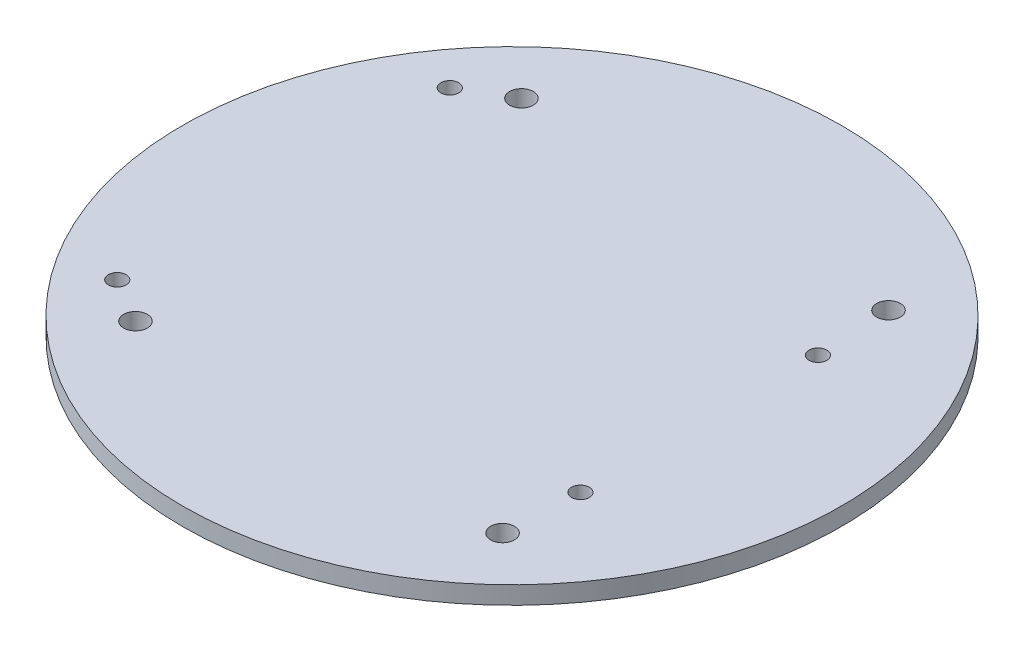
ISO-10303-21;
HEADER;
FILE_DESCRIPTION(('STEP AP214'),'2;1');
FILE_NAME('part.step','',(''),(''),'','','');
FILE_SCHEMA(('AUTOMOTIVE_DESIGN { 1 0 10303 214 1 1 1 1 }'));
ENDSEC;
DATA;
#1=APPLICATION_CONTEXT('core data for automotive mechanical design processes');
#2=APPLICATION_PROTOCOL_DEFINITION('international standard','automotive_design',2000,#1);
#3=PRODUCT_CONTEXT('',#1,'mechanical');
#4=PRODUCT('Part','Part','',(#3));
#5=PRODUCT_RELATED_PRODUCT_CATEGORY('part','',(#4));
#6=PRODUCT_DEFINITION_FORMATION('','',#4);
#7=PRODUCT_DEFINITION_CONTEXT('part definition',#1,'design');
#8=PRODUCT_DEFINITION('design','',#6,#7);
#9=PRODUCT_DEFINITION_SHAPE('','',#8);
#10=(LENGTH_UNIT() NAMED_UNIT(*) SI_UNIT(.MILLI.,.METRE.));
#11=(NAMED_UNIT(*) PLANE_ANGLE_UNIT() SI_UNIT($,.RADIAN.));
#12=(NAMED_UNIT(*) SI_UNIT($,.STERADIAN.) SOLID_ANGLE_UNIT());
#13=UNCERTAINTY_MEASURE_WITH_UNIT(LENGTH_MEASURE(1.E-05),#10,'distance_accuracy_value','');
#14=(GEOMETRIC_REPRESENTATION_CONTEXT(3) GLOBAL_UNCERTAINTY_ASSIGNED_CONTEXT((#13)) GLOBAL_UNIT_ASSIGNED_CONTEXT((#10,
#11,#12)) REPRESENTATION_CONTEXT('',''));
#15=CARTESIAN_POINT('',(0.,0.,0.));
#16=DIRECTION('',(0.,0.,1.));
#17=DIRECTION('',(1.,0.,0.));
#18=AXIS2_PLACEMENT_3D('',#15,#16,#17);
#19=CARTESIAN_POINT('',(0.,3.,0.));
#20=DIRECTION('',(0.,-1.,0.));
#21=DIRECTION('',(0.,0.,-1.));
#22=AXIS2_PLACEMENT_3D('',#19,#20,#21);
#23=CYLINDRICAL_SURFACE('',#22,55.5);
#24=CARTESIAN_POINT('',(0.,3.,0.));
#25=DIRECTION('',(0.,1.,0.));
#26=DIRECTION('',(0.,0.,1.));
#27=AXIS2_PLACEMENT_3D('',#24,#25,#26);
#28=CIRCLE('',#27,55.5);
#29=CARTESIAN_POINT('',(0.,3.,55.5));
#30=VERTEX_POINT('',#29);
#31=EDGE_CURVE('E12',#30,#30,#28,.T.);
#32=ORIENTED_EDGE('',*,*,#31,.F.);
#33=EDGE_LOOP('',(#32));
#34=FACE_BOUND('',#33,.T.);
#35=CARTESIAN_POINT('',(0.,0.,0.));
#36=DIRECTION('',(0.,1.,0.));
#37=DIRECTION('',(0.,0.,1.));
#38=AXIS2_PLACEMENT_3D('',#35,#36,#37);
#39=CIRCLE('',#38,55.5);
#40=CARTESIAN_POINT('',(0.,0.,55.5));
#41=VERTEX_POINT('',#40);
#42=EDGE_CURVE('E49',#41,#41,#39,.T.);
#43=ORIENTED_EDGE('',*,*,#42,.T.);
#44=EDGE_LOOP('',(#43));
#45=FACE_BOUND('',#44,.T.);
#46=ADVANCED_FACE('F42',(#34,#45),#23,.T.);
#47=CARTESIAN_POINT('',(0.,3.,0.));
#48=DIRECTION('',(0.,1.,0.));
#49=DIRECTION('',(0.,0.,1.));
#50=AXIS2_PLACEMENT_3D('',#47,#48,#49);
#51=PLANE('',#50);
#52=CARTESIAN_POINT('',(-30.9068249043127,3.,-32.5));
#53=DIRECTION('',(0.,1.,0.));
#54=DIRECTION('',(0.,0.,1.));
#55=AXIS2_PLACEMENT_3D('',#52,#53,#54);
#56=CIRCLE('',#55,2.);
#57=CARTESIAN_POINT('',(-30.9068249043127,3.,-30.5));
#58=VERTEX_POINT('',#57);
#59=EDGE_CURVE('E100',#58,#58,#56,.T.);
#60=ORIENTED_EDGE('',*,*,#59,.F.);
#61=EDGE_LOOP('',(#60));
#62=FACE_BOUND('',#61,.T.);
#63=CARTESIAN_POINT('',(30.9068249043127,3.,-32.5));
#64=DIRECTION('',(0.,1.,0.));
#65=DIRECTION('',(0.,0.,1.));
#66=AXIS2_PLACEMENT_3D('',#63,#64,#65);
#67=CIRCLE('',#66,1.99999999999999);
#68=CARTESIAN_POINT('',(30.9068249043127,3.,-30.5));
#69=VERTEX_POINT('',#68);
#70=EDGE_CURVE('E97',#69,#69,#67,.T.);
#71=ORIENTED_EDGE('',*,*,#70,.F.);
#72=EDGE_LOOP('',(#71));
#73=FACE_BOUND('',#72,.T.);
#74=CARTESIAN_POINT('',(30.9068249043127,3.,32.5));
#75=DIRECTION('',(0.,1.,0.));
#76=DIRECTION('',(0.,0.,1.));
#77=AXIS2_PLACEMENT_3D('',#74,#75,#76);
#78=CIRCLE('',#77,1.99999999999999);
#79=CARTESIAN_POINT('',(30.9068249043127,3.,34.5));
#80=VERTEX_POINT('',#79);
#81=EDGE_CURVE('E91',#80,#80,#78,.T.);
#82=ORIENTED_EDGE('',*,*,#81,.F.);
#83=EDGE_LOOP('',(#82));
#84=FACE_BOUND('',#83,.T.);
#85=CARTESIAN_POINT('',(-30.9068249043127,3.,32.5));
#86=DIRECTION('',(0.,1.,0.));
#87=DIRECTION('',(0.,0.,1.));
#88=AXIS2_PLACEMENT_3D('',#85,#86,#87);
#89=CIRCLE('',#88,2.);
#90=CARTESIAN_POINT('',(-30.9068249043127,3.,34.5));
#91=VERTEX_POINT('',#90);
#92=EDGE_CURVE('E85',#91,#91,#89,.T.);
#93=ORIENTED_EDGE('',*,*,#92,.F.);
#94=EDGE_LOOP('',(#93));
#95=FACE_BOUND('',#94,.T.);
#96=CARTESIAN_POINT('',(-38.4762620741874,3.,-27.9999942282166));
#97=DIRECTION('',(0.,1.,0.));
#98=DIRECTION('',(0.,0.,1.));
#99=AXIS2_PLACEMENT_3D('',#96,#97,#98);
#100=CIRCLE('',#99,1.49999999999999);
#101=CARTESIAN_POINT('',(-38.4762620741874,3.,-26.4999942282166));
#102=VERTEX_POINT('',#101);
#103=EDGE_CURVE('E79',#102,#102,#100,.T.);
#104=ORIENTED_EDGE('',*,*,#103,.F.);
#105=EDGE_LOOP('',(#104));
#106=FACE_BOUND('',#105,.T.);
#107=CARTESIAN_POINT('',(31.5237385540336,3.,-19.9999997251527));
#108=DIRECTION('',(0.,1.,0.));
#109=DIRECTION('',(0.,0.,1.));
#110=AXIS2_PLACEMENT_3D('',#107,#108,#109);
#111=CIRCLE('',#110,1.49999999999999);
#112=CARTESIAN_POINT('',(31.5237385540336,3.,-18.4999997251527));
#113=VERTEX_POINT('',#112);
#114=EDGE_CURVE('E71',#113,#113,#111,.T.);
#115=ORIENTED_EDGE('',*,*,#114,.F.);
#116=EDGE_LOOP('',(#115));
#117=FACE_BOUND('',#116,.T.);
#118=CARTESIAN_POINT('',(31.5237416951402,3.,20.0000002748467));
#119=DIRECTION('',(0.,1.,0.));
#120=DIRECTION('',(0.,0.,1.));
#121=AXIS2_PLACEMENT_3D('',#118,#119,#120);
#122=CIRCLE('',#121,1.49999999999999);
#123=CARTESIAN_POINT('',(31.5237416951402,3.,21.5000002748467));
#124=VERTEX_POINT('',#123);
#125=EDGE_CURVE('E61',#124,#124,#122,.T.);
#126=ORIENTED_EDGE('',*,*,#125,.F.);
#127=EDGE_LOOP('',(#126));
#128=FACE_BOUND('',#127,.T.);
#129=CARTESIAN_POINT('',(-38.4762576766382,3.,28.0000057717837));
#130=DIRECTION('',(0.,1.,0.));
#131=DIRECTION('',(0.,0.,1.));
#132=AXIS2_PLACEMENT_3D('',#129,#130,#131);
#133=CIRCLE('',#132,1.49999999999999);
#134=CARTESIAN_POINT('',(-38.4762576766382,3.,29.5000057717837));
#135=VERTEX_POINT('',#134);
#136=EDGE_CURVE('E60',#135,#135,#133,.T.);
#137=ORIENTED_EDGE('',*,*,#136,.F.);
#138=EDGE_LOOP('',(#137));
#139=FACE_BOUND('',#138,.T.);
#140=ORIENTED_EDGE('',*,*,#31,.T.);
#141=EDGE_LOOP('',(#140));
#142=FACE_BOUND('',#141,.T.);
#143=ADVANCED_FACE('F121',(#62,#73,#84,#95,#106,#117,#128,#139,#142),#51,.T.);
#144=CARTESIAN_POINT('',(0.,0.,0.));
#145=DIRECTION('',(0.,1.,0.));
#146=DIRECTION('',(0.,0.,1.));
#147=AXIS2_PLACEMENT_3D('',#144,#145,#146);
#148=PLANE('',#147);
#149=CARTESIAN_POINT('',(-30.9068249043127,0.,-32.5));
#150=DIRECTION('',(0.,1.,0.));
#151=DIRECTION('',(0.,0.,1.));
#152=AXIS2_PLACEMENT_3D('',#149,#150,#151);
#153=CIRCLE('',#152,2.);
#154=CARTESIAN_POINT('',(-30.9068249043127,0.,-30.5));
#155=VERTEX_POINT('',#154);
#156=EDGE_CURVE('E45',#155,#155,#153,.T.);
#157=ORIENTED_EDGE('',*,*,#156,.T.);
#158=EDGE_LOOP('',(#157));
#159=FACE_BOUND('',#158,.T.);
#160=CARTESIAN_POINT('',(30.9068249043127,0.,-32.5));
#161=DIRECTION('',(0.,1.,0.));
#162=DIRECTION('',(0.,0.,1.));
#163=AXIS2_PLACEMENT_3D('',#160,#161,#162);
#164=CIRCLE('',#163,1.99999999999999);
#165=CARTESIAN_POINT('',(30.9068249043127,0.,-30.5));
#166=VERTEX_POINT('',#165);
#167=EDGE_CURVE('E94',#166,#166,#164,.T.);
#168=ORIENTED_EDGE('',*,*,#167,.T.);
#169=EDGE_LOOP('',(#168));
#170=FACE_BOUND('',#169,.T.);
#171=CARTESIAN_POINT('',(30.9068249043127,0.,32.5));
#172=DIRECTION('',(0.,1.,0.));
#173=DIRECTION('',(0.,0.,1.));
#174=AXIS2_PLACEMENT_3D('',#171,#172,#173);
#175=CIRCLE('',#174,1.99999999999999);
#176=CARTESIAN_POINT('',(30.9068249043127,0.,34.5));
#177=VERTEX_POINT('',#176);
#178=EDGE_CURVE('E88',#177,#177,#175,.T.);
#179=ORIENTED_EDGE('',*,*,#178,.T.);
#180=EDGE_LOOP('',(#179));
#181=FACE_BOUND('',#180,.T.);
#182=CARTESIAN_POINT('',(-30.9068249043127,0.,32.5));
#183=DIRECTION('',(0.,1.,0.));
#184=DIRECTION('',(0.,0.,1.));
#185=AXIS2_PLACEMENT_3D('',#182,#183,#184);
#186=CIRCLE('',#185,2.);
#187=CARTESIAN_POINT('',(-30.9068249043127,0.,34.5));
#188=VERTEX_POINT('',#187);
#189=EDGE_CURVE('E82',#188,#188,#186,.T.);
#190=ORIENTED_EDGE('',*,*,#189,.T.);
#191=EDGE_LOOP('',(#190));
#192=FACE_BOUND('',#191,.T.);
#193=CARTESIAN_POINT('',(-38.4762620741874,0.,-27.9999942282166));
#194=DIRECTION('',(0.,1.,0.));
#195=DIRECTION('',(0.,0.,1.));
#196=AXIS2_PLACEMENT_3D('',#193,#194,#195);
#197=CIRCLE('',#196,1.49999999999999);
#198=CARTESIAN_POINT('',(-38.4762620741874,0.,-26.4999942282166));
#199=VERTEX_POINT('',#198);
#200=EDGE_CURVE('E76',#199,#199,#197,.T.);
#201=ORIENTED_EDGE('',*,*,#200,.T.);
#202=EDGE_LOOP('',(#201));
#203=FACE_BOUND('',#202,.T.);
#204=CARTESIAN_POINT('',(31.5237385540336,0.,-19.9999997251527));
#205=DIRECTION('',(0.,1.,0.));
#206=DIRECTION('',(0.,0.,1.));
#207=AXIS2_PLACEMENT_3D('',#204,#205,#206);
#208=CIRCLE('',#207,1.49999999999999);
#209=CARTESIAN_POINT('',(31.5237385540336,0.,-18.4999997251527));
#210=VERTEX_POINT('',#209);
#211=EDGE_CURVE('E66',#210,#210,#208,.T.);
#212=ORIENTED_EDGE('',*,*,#211,.T.);
#213=EDGE_LOOP('',(#212));
#214=FACE_BOUND('',#213,.T.);
#215=CARTESIAN_POINT('',(31.5237416951402,0.,20.0000002748467));
#216=DIRECTION('',(0.,1.,0.));
#217=DIRECTION('',(0.,0.,1.));
#218=AXIS2_PLACEMENT_3D('',#215,#216,#217);
#219=CIRCLE('',#218,1.49999999999999);
#220=CARTESIAN_POINT('',(31.5237416951402,0.,21.5000002748467));
#221=VERTEX_POINT('',#220);
#222=EDGE_CURVE('E58',#221,#221,#219,.T.);
#223=ORIENTED_EDGE('',*,*,#222,.T.);
#224=EDGE_LOOP('',(#223));
#225=FACE_BOUND('',#224,.T.);
#226=CARTESIAN_POINT('',(-38.4762576766382,0.,28.0000057717837));
#227=DIRECTION('',(0.,1.,0.));
#228=DIRECTION('',(0.,0.,1.));
#229=AXIS2_PLACEMENT_3D('',#226,#227,#228);
#230=CIRCLE('',#229,1.49999999999999);
#231=CARTESIAN_POINT('',(-38.4762576766382,0.,29.5000057717837));
#232=VERTEX_POINT('',#231);
#233=EDGE_CURVE('E54',#232,#232,#230,.T.);
#234=ORIENTED_EDGE('',*,*,#233,.T.);
#235=EDGE_LOOP('',(#234));
#236=FACE_BOUND('',#235,.T.);
#237=ORIENTED_EDGE('',*,*,#42,.F.);
#238=EDGE_LOOP('',(#237));
#239=FACE_BOUND('',#238,.T.);
#240=ADVANCED_FACE('F107',(#159,#170,#181,#192,#203,#214,#225,#236,#239),#148,.F.);
#241=CARTESIAN_POINT('',(-38.4762576766382,3.,28.0000057717837));
#242=DIRECTION('',(0.,1.,0.));
#243=DIRECTION('',(0.,0.,1.));
#244=AXIS2_PLACEMENT_3D('',#241,#242,#243);
#245=CYLINDRICAL_SURFACE('',#244,1.49999999999999);
#246=ORIENTED_EDGE('',*,*,#136,.T.);
#247=EDGE_LOOP('',(#246));
#248=FACE_BOUND('',#247,.T.);
#249=ORIENTED_EDGE('',*,*,#233,.F.);
#250=EDGE_LOOP('',(#249));
#251=FACE_BOUND('',#250,.T.);
#252=ADVANCED_FACE('F132',(#248,#251),#245,.F.);
#253=CARTESIAN_POINT('',(31.5237416951402,3.,20.0000002748467));
#254=DIRECTION('',(0.,1.,0.));
#255=DIRECTION('',(0.,0.,1.));
#256=AXIS2_PLACEMENT_3D('',#253,#254,#255);
#257=CYLINDRICAL_SURFACE('',#256,1.49999999999999);
#258=ORIENTED_EDGE('',*,*,#125,.T.);
#259=EDGE_LOOP('',(#258));
#260=FACE_BOUND('',#259,.T.);
#261=ORIENTED_EDGE('',*,*,#222,.F.);
#262=EDGE_LOOP('',(#261));
#263=FACE_BOUND('',#262,.T.);
#264=ADVANCED_FACE('F136',(#260,#263),#257,.F.);
#265=CARTESIAN_POINT('',(31.5237385540336,3.,-19.9999997251527));
#266=DIRECTION('',(0.,1.,0.));
#267=DIRECTION('',(0.,0.,1.));
#268=AXIS2_PLACEMENT_3D('',#265,#266,#267);
#269=CYLINDRICAL_SURFACE('',#268,1.49999999999999);
#270=ORIENTED_EDGE('',*,*,#114,.T.);
#271=EDGE_LOOP('',(#270));
#272=FACE_BOUND('',#271,.T.);
#273=ORIENTED_EDGE('',*,*,#211,.F.);
#274=EDGE_LOOP('',(#273));
#275=FACE_BOUND('',#274,.T.);
#276=ADVANCED_FACE('F142',(#272,#275),#269,.F.);
#277=CARTESIAN_POINT('',(-38.4762620741874,3.,-27.9999942282166));
#278=DIRECTION('',(0.,1.,0.));
#279=DIRECTION('',(0.,0.,1.));
#280=AXIS2_PLACEMENT_3D('',#277,#278,#279);
#281=CYLINDRICAL_SURFACE('',#280,1.49999999999999);
#282=ORIENTED_EDGE('',*,*,#103,.T.);
#283=EDGE_LOOP('',(#282));
#284=FACE_BOUND('',#283,.T.);
#285=ORIENTED_EDGE('',*,*,#200,.F.);
#286=EDGE_LOOP('',(#285));
#287=FACE_BOUND('',#286,.T.);
#288=ADVANCED_FACE('F145',(#284,#287),#281,.F.);
#289=CARTESIAN_POINT('',(-30.9068249043127,3.,32.5));
#290=DIRECTION('',(0.,1.,0.));
#291=DIRECTION('',(0.,0.,1.));
#292=AXIS2_PLACEMENT_3D('',#289,#290,#291);
#293=CYLINDRICAL_SURFACE('',#292,2.);
#294=ORIENTED_EDGE('',*,*,#92,.T.);
#295=EDGE_LOOP('',(#294));
#296=FACE_BOUND('',#295,.T.);
#297=ORIENTED_EDGE('',*,*,#189,.F.);
#298=EDGE_LOOP('',(#297));
#299=FACE_BOUND('',#298,.T.);
#300=ADVANCED_FACE('F149',(#296,#299),#293,.F.);
#301=CARTESIAN_POINT('',(30.9068249043127,3.,32.5));
#302=DIRECTION('',(0.,1.,0.));
#303=DIRECTION('',(0.,0.,1.));
#304=AXIS2_PLACEMENT_3D('',#301,#302,#303);
#305=CYLINDRICAL_SURFACE('',#304,1.99999999999999);
#306=ORIENTED_EDGE('',*,*,#81,.T.);
#307=EDGE_LOOP('',(#306));
#308=FACE_BOUND('',#307,.T.);
#309=ORIENTED_EDGE('',*,*,#178,.F.);
#310=EDGE_LOOP('',(#309));
#311=FACE_BOUND('',#310,.T.);
#312=ADVANCED_FACE('F117',(#308,#311),#305,.F.);
#313=CARTESIAN_POINT('',(30.9068249043127,3.,-32.5));
#314=DIRECTION('',(0.,1.,0.));
#315=DIRECTION('',(0.,0.,1.));
#316=AXIS2_PLACEMENT_3D('',#313,#314,#315);
#317=CYLINDRICAL_SURFACE('',#316,1.99999999999999);
#318=ORIENTED_EDGE('',*,*,#70,.T.);
#319=EDGE_LOOP('',(#318));
#320=FACE_BOUND('',#319,.T.);
#321=ORIENTED_EDGE('',*,*,#167,.F.);
#322=EDGE_LOOP('',(#321));
#323=FACE_BOUND('',#322,.T.);
#324=ADVANCED_FACE('F112',(#320,#323),#317,.F.);
#325=CARTESIAN_POINT('',(-30.9068249043127,3.,-32.5));
#326=DIRECTION('',(0.,1.,0.));
#327=DIRECTION('',(0.,0.,1.));
#328=AXIS2_PLACEMENT_3D('',#325,#326,#327);
#329=CYLINDRICAL_SURFACE('',#328,2.);
#330=ORIENTED_EDGE('',*,*,#59,.T.);
#331=EDGE_LOOP('',(#330));
#332=FACE_BOUND('',#331,.T.);
#333=ORIENTED_EDGE('',*,*,#156,.F.);
#334=EDGE_LOOP('',(#333));
#335=FACE_BOUND('',#334,.T.);
#336=ADVANCED_FACE('F110',(#332,#335),#329,.F.);
#337=CLOSED_SHELL('',(#46,#143,#240,#252,#264,#276,#288,#300,#312,#324,#336));
#338=MANIFOLD_SOLID_BREP('B2',#337);
#339=ADVANCED_BREP_SHAPE_REPRESENTATION('',(#18,#338),#14);
#340=SHAPE_DEFINITION_REPRESENTATION(#9,#339);
ENDSEC;
END-ISO-10303-21;
